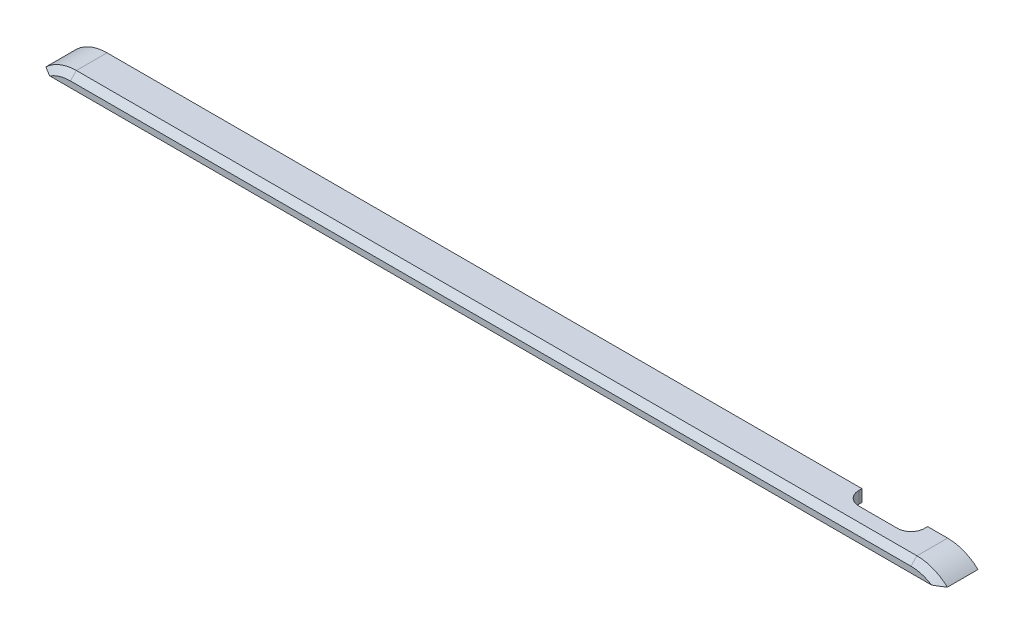
ISO-10303-21;
HEADER;
FILE_DESCRIPTION(('STEP AP214'),'2;1');
FILE_NAME('part.step','',(''),(''),'','','');
FILE_SCHEMA(('AUTOMOTIVE_DESIGN { 1 0 10303 214 1 1 1 1 }'));
ENDSEC;
DATA;
#1=APPLICATION_CONTEXT('core data for automotive mechanical design processes');
#2=APPLICATION_PROTOCOL_DEFINITION('international standard','automotive_design',2000,#1);
#3=PRODUCT_CONTEXT('',#1,'mechanical');
#4=PRODUCT('Part','Part','',(#3));
#5=PRODUCT_RELATED_PRODUCT_CATEGORY('part','',(#4));
#6=PRODUCT_DEFINITION_FORMATION('','',#4);
#7=PRODUCT_DEFINITION_CONTEXT('part definition',#1,'design');
#8=PRODUCT_DEFINITION('design','',#6,#7);
#9=PRODUCT_DEFINITION_SHAPE('','',#8);
#10=(LENGTH_UNIT() NAMED_UNIT(*) SI_UNIT(.MILLI.,.METRE.));
#11=(NAMED_UNIT(*) PLANE_ANGLE_UNIT() SI_UNIT($,.RADIAN.));
#12=(NAMED_UNIT(*) SI_UNIT($,.STERADIAN.) SOLID_ANGLE_UNIT());
#13=UNCERTAINTY_MEASURE_WITH_UNIT(LENGTH_MEASURE(1.E-05),#10,'distance_accuracy_value','');
#14=(GEOMETRIC_REPRESENTATION_CONTEXT(3) GLOBAL_UNCERTAINTY_ASSIGNED_CONTEXT((#13)) GLOBAL_UNIT_ASSIGNED_CONTEXT((#10,
#11,#12)) REPRESENTATION_CONTEXT('',''));
#15=CARTESIAN_POINT('',(0.,0.,0.));
#16=DIRECTION('',(0.,0.,1.));
#17=DIRECTION('',(1.,0.,0.));
#18=AXIS2_PLACEMENT_3D('',#15,#16,#17);
#19=CARTESIAN_POINT('',(-13.48999964809,95.544999648097,2.9));
#20=DIRECTION('',(0.,0.,1.));
#21=DIRECTION('',(1.,0.,0.));
#22=AXIS2_PLACEMENT_3D('',#19,#20,#21);
#23=CYLINDRICAL_SURFACE('',#22,7.40000035190612);
#24=DIRECTION('',(0.,0.,1.));
#25=VECTOR('',#24,1.);
#26=CARTESIAN_POINT('',(-18.549644043465,100.945000000001,2.9));
#27=LINE('',#26,#25);
#28=CARTESIAN_POINT('',(-18.549644043465,100.945000000001,3.09999999999999));
#29=VERTEX_POINT('',#28);
#30=CARTESIAN_POINT('',(-18.549644043465,100.945000000001,-2.));
#31=VERTEX_POINT('',#30);
#32=EDGE_CURVE('E66',#29,#31,#27,.F.);
#33=ORIENTED_EDGE('',*,*,#32,.F.);
#34=CARTESIAN_POINT('',(-13.48999964809,95.544999648097,3.09999999999999));
#35=DIRECTION('',(0.,0.,1.));
#36=DIRECTION('',(1.,0.,0.));
#37=AXIS2_PLACEMENT_3D('',#34,#35,#36);
#38=CIRCLE('',#37,7.40000035190612);
#39=CARTESIAN_POINT('',(-13.490000824045,102.945000000001,3.09999999999999));
#40=VERTEX_POINT('',#39);
#41=EDGE_CURVE('E219',#29,#40,#38,.F.);
#42=ORIENTED_EDGE('',*,*,#41,.T.);
#43=DIRECTION('',(0.,0.,1.));
#44=VECTOR('',#43,1.);
#45=CARTESIAN_POINT('',(-13.490000824045,102.945000000001,2.9));
#46=LINE('',#45,#44);
#47=CARTESIAN_POINT('',(-13.490000824045,102.945000000001,-2.));
#48=VERTEX_POINT('',#47);
#49=EDGE_CURVE('E201',#48,#40,#46,.T.);
#50=ORIENTED_EDGE('',*,*,#49,.F.);
#51=CARTESIAN_POINT('',(-13.48999964809,95.544999648097,-2.));
#52=DIRECTION('',(0.,0.,-1.));
#53=DIRECTION('',(-1.,0.,0.));
#54=AXIS2_PLACEMENT_3D('',#51,#52,#53);
#55=CIRCLE('',#54,7.40000035190612);
#56=EDGE_CURVE('E198',#48,#31,#55,.F.);
#57=ORIENTED_EDGE('',*,*,#56,.T.);
#58=EDGE_LOOP('',(#33,#42,#50,#57));
#59=FACE_BOUND('',#58,.T.);
#60=ADVANCED_FACE('F43',(#59),#23,.T.);
#61=CARTESIAN_POINT('',(126.37999964809,101.945000000001,4.1));
#62=DIRECTION('',(0.,-0.707106781186546,-0.707106781186549));
#63=DIRECTION('',(-1.,0.,0.));
#64=AXIS2_PLACEMENT_3D('',#61,#62,#63);
#65=PLANE('',#64);
#66=DIRECTION('',(0.,0.70710678118669,-0.707106781186405));
#67=VECTOR('',#66,1.);
#68=CARTESIAN_POINT('',(126.380005863851,101.944999999999,4.1));
#69=LINE('',#68,#67);
#70=CARTESIAN_POINT('',(126.380005863851,101.944999999999,4.1));
#71=VERTEX_POINT('',#70);
#72=CARTESIAN_POINT('',(126.380005863851,102.944999999999,3.09999999999999));
#73=VERTEX_POINT('',#72);
#74=EDGE_CURVE('E227',#71,#73,#69,.T.);
#75=ORIENTED_EDGE('',*,*,#74,.T.);
#76=DIRECTION('',(1.,0.,0.));
#77=VECTOR('',#76,1.);
#78=CARTESIAN_POINT('',(111.58999933321,102.945000000001,3.09999999999999));
#79=LINE('',#78,#77);
#80=EDGE_CURVE('E216',#40,#73,#79,.T.);
#81=ORIENTED_EDGE('',*,*,#80,.F.);
#82=DIRECTION('',(0.,-0.707106781186557,0.707106781186538));
#83=VECTOR('',#82,1.);
#84=CARTESIAN_POINT('',(-13.490000824045,102.945000000003,3.09999999999999));
#85=LINE('',#84,#83);
#86=CARTESIAN_POINT('',(-13.490000824045,101.945000000003,4.1));
#87=VERTEX_POINT('',#86);
#88=EDGE_CURVE('E225',#40,#87,#85,.T.);
#89=ORIENTED_EDGE('',*,*,#88,.T.);
#90=DIRECTION('',(-1.,0.,0.));
#91=VECTOR('',#90,1.);
#92=CARTESIAN_POINT('',(126.37999964809,101.945000000001,4.1));
#93=LINE('',#92,#91);
#94=EDGE_CURVE('E213',#71,#87,#93,.T.);
#95=ORIENTED_EDGE('',*,*,#94,.F.);
#96=EDGE_LOOP('',(#75,#81,#89,#95));
#97=FACE_BOUND('',#96,.T.);
#98=ADVANCED_FACE('F247',(#97),#65,.F.);
#99=CARTESIAN_POINT('',(126.37999964809,95.544999648097,4.1));
#100=DIRECTION('',(0.,0.,1.));
#101=DIRECTION('',(1.,0.,0.));
#102=AXIS2_PLACEMENT_3D('',#99,#100,#101);
#103=PLANE('',#102);
#104=DIRECTION('',(-1.,0.,0.));
#105=VECTOR('',#104,1.);
#106=CARTESIAN_POINT('',(126.37999964809,100.945000000001,4.1));
#107=LINE('',#106,#105);
#108=CARTESIAN_POINT('',(129.815112557999,100.945000000001,4.1));
#109=VERTEX_POINT('',#108);
#110=CARTESIAN_POINT('',(-16.925112558001,100.945000000001,4.1));
#111=VERTEX_POINT('',#110);
#112=EDGE_CURVE('E234',#109,#111,#107,.T.);
#113=ORIENTED_EDGE('',*,*,#112,.F.);
#114=CARTESIAN_POINT('',(126.37999964809,95.544999648097,4.1));
#115=DIRECTION('',(0.,0.,1.));
#116=DIRECTION('',(1.,0.,0.));
#117=AXIS2_PLACEMENT_3D('',#114,#115,#116);
#118=CIRCLE('',#117,6.40000035190484);
#119=EDGE_CURVE('E208',#109,#71,#118,.T.);
#120=ORIENTED_EDGE('',*,*,#119,.T.);
#121=ORIENTED_EDGE('',*,*,#94,.T.);
#122=CARTESIAN_POINT('',(-13.48999964809,95.544999648097,4.1));
#123=DIRECTION('',(0.,0.,1.));
#124=DIRECTION('',(1.,0.,0.));
#125=AXIS2_PLACEMENT_3D('',#122,#123,#124);
#126=CIRCLE('',#125,6.40000035190612);
#127=EDGE_CURVE('E210',#87,#111,#126,.T.);
#128=ORIENTED_EDGE('',*,*,#127,.T.);
#129=EDGE_LOOP('',(#113,#120,#121,#128));
#130=FACE_BOUND('',#129,.T.);
#131=ADVANCED_FACE('F246',(#130),#103,.T.);
#132=CARTESIAN_POINT('',(-13.48999964809,95.544999648097,4.1));
#133=DIRECTION('',(0.,0.,-1.));
#134=DIRECTION('',(-1.,0.,0.));
#135=AXIS2_PLACEMENT_3D('',#132,#133,#134);
#136=CONICAL_SURFACE('',#135,6.40000035190612,0.785398163397452);
#137=CARTESIAN_POINT('',(-9.00944418539805,100.945000000001,3.48320756211818));
#138=CARTESIAN_POINT('',(-9.11736197304797,100.945000000001,3.5521074484552));
#139=CARTESIAN_POINT('',(-9.22594553083226,100.945000000001,3.61997900357435));
#140=CARTESIAN_POINT('',(-9.44460972842669,100.945000000001,3.75332454421374));
#141=CARTESIAN_POINT('',(-9.55469072734905,100.945000000001,3.81879794020001));
#142=CARTESIAN_POINT('',(-9.77696502495285,100.945000000001,3.94726253204156));
#143=CARTESIAN_POINT('',(-9.88916563272331,100.945000000001,4.01024114179886));
#144=CARTESIAN_POINT('',(-10.1153208660946,100.945000000001,4.1329405936068));
#145=CARTESIAN_POINT('',(-10.2292753815703,100.945000000001,4.19266163913337));
#146=CARTESIAN_POINT('',(-10.5797748471458,100.945000000001,4.36910594692507));
#147=CARTESIAN_POINT('',(-10.8194017725302,100.945000000001,4.47983725074103));
#148=CARTESIAN_POINT('',(-11.3072076013879,100.945000000001,4.6797492608799));
#149=CARTESIAN_POINT('',(-11.5553700308363,100.945000000001,4.76896908199745));
#150=CARTESIAN_POINT('',(-11.9664119266231,100.945000000001,4.8912227583544));
#151=CARTESIAN_POINT('',(-12.1267409130999,100.945000000001,4.93281793742468));
#152=CARTESIAN_POINT('',(-12.4502592753289,100.945000000001,5.00307774554259));
#153=CARTESIAN_POINT('',(-12.6134486941357,100.945000000001,5.03174217978554));
#154=CARTESIAN_POINT('',(-12.9400897726518,100.945000000001,5.07446199929388));
#155=CARTESIAN_POINT('',(-13.1035223861598,100.945000000001,5.08866102537679));
#156=CARTESIAN_POINT('',(-13.431004213152,100.945000000001,5.10215556839109));
#157=CARTESIAN_POINT('',(-13.5950533932365,100.945000000001,5.1014518812967));
#158=CARTESIAN_POINT('',(-13.9227583715392,100.945000000001,5.08516557353507));
#159=CARTESIAN_POINT('',(-14.0864125284281,100.945000000001,5.06955046475873));
#160=CARTESIAN_POINT('',(-14.411750293435,100.945000000001,5.02426686958916));
#161=CARTESIAN_POINT('',(-14.5734336997909,100.945000000001,4.99459695648095));
#162=CARTESIAN_POINT('',(-14.8948051182586,100.945000000001,4.92247316998566));
#163=CARTESIAN_POINT('',(-15.0544775880741,100.945000000001,4.87995095368624));
#164=CARTESIAN_POINT('',(-15.370442702256,100.945000000001,4.78393507827452));
#165=CARTESIAN_POINT('',(-15.5267354008834,100.945000000001,4.73044159544636));
#166=CARTESIAN_POINT('',(-15.874463538354,100.945000000001,4.59969492946357));
#167=CARTESIAN_POINT('',(-16.0649170216191,100.945000000001,4.5198451185541));
#168=CARTESIAN_POINT('',(-16.4406579292946,100.945000000001,4.3487087837962));
#169=CARTESIAN_POINT('',(-16.6259426680003,100.945000000001,4.25741644486292));
#170=CARTESIAN_POINT('',(-16.9921329634059,100.945000000001,4.06567325682538));
#171=CARTESIAN_POINT('',(-17.1730293197188,100.945000000001,3.96520497095776));
#172=CARTESIAN_POINT('',(-17.5306339133796,100.945000000001,3.75718300285243));
#173=CARTESIAN_POINT('',(-17.7073428250256,100.945000000001,3.64963047206863));
#174=CARTESIAN_POINT('',(-18.0587273965895,100.945000000001,3.42790435203163));
#175=CARTESIAN_POINT('',(-18.233371283848,100.945000000001,3.31368064681412));
#176=CARTESIAN_POINT('',(-18.5795509271449,100.945000000001,3.08062294077936));
#177=CARTESIAN_POINT('',(-18.7510865892495,100.945000000001,2.96178880096983));
#178=CARTESIAN_POINT('',(-19.0913122403084,100.945000000001,2.72051825243802));
#179=CARTESIAN_POINT('',(-19.2600051723948,100.945000000001,2.59808598203824));
#180=CARTESIAN_POINT('',(-19.5951299794649,100.945000000001,2.35015884295758));
#181=CARTESIAN_POINT('',(-19.7615617667756,100.945000000001,2.22466385604829));
#182=CARTESIAN_POINT('',(-20.1083249047972,100.945000000001,1.95900232844192));
#183=CARTESIAN_POINT('',(-20.2884612123179,100.945000000001,1.81858156847848));
#184=CARTESIAN_POINT('',(-20.6467511663923,100.945000000001,1.53523010251118));
#185=CARTESIAN_POINT('',(-20.824904767247,100.945000000001,1.39229933884968));
#186=CARTESIAN_POINT('',(-21.3569512243515,100.945000000001,0.960300736912029));
#187=CARTESIAN_POINT('',(-21.7083135651146,100.945000000001,0.668116482775576));
#188=CARTESIAN_POINT('',(-22.3971899366675,100.945000000001,0.085331926828471));
#189=CARTESIAN_POINT('',(-22.7348293010031,100.945000000001,-0.205121005262719));
#190=CARTESIAN_POINT('',(-23.2384493614037,100.945000000001,-0.643855433070635));
#191=CARTESIAN_POINT('',(-23.4058016254663,100.945000000001,-0.790566600273585));
#192=CARTESIAN_POINT('',(-23.7396938154997,100.945000000001,-1.08490536789007));
#193=CARTESIAN_POINT('',(-23.9062337542065,100.945000000001,-1.23253295385259));
#194=CARTESIAN_POINT('',(-24.0724204772396,100.945000000001,-1.38055663864696));
#195=B_SPLINE_CURVE_WITH_KNOTS('',3,(#137,#138,#139,#140,#141,#142,#143,#144,#145,#146,#147,
#148,#149,#150,#151,#152,#153,#154,#155,#156,#157,#158,#159,#160,#161,#162,#163,#164,#165,#166,
#167,#168,#169,#170,#171,#172,#173,#174,#175,#176,#177,#178,#179,#180,#181,#182,#183,#184,#185,
#186,#187,#188,#189,#190,#191,#192,#193,#194),.UNSPECIFIED.,.F.,.F.,(4,2,2,2,2,2,2,2,2,2,2,2,2,
2,2,2,2,2,2,2,2,2,2,2,2,2,2,2,4),(0.,0.384115829699168,0.768325460492912,1.15427533083495,
1.54020106607223,2.33135916525918,3.12106764807376,3.6175298077362,4.11399944646662,
4.60548964598309,5.09695359440433,5.58949076379726,6.08207794176892,6.5773319953368,
7.07257809188317,7.69162819157976,8.31099417747414,8.93156263676902,9.5520304782717,
10.1779820150825,10.803952437346,11.4292291029944,12.0545299441631,12.7397057539393,
13.4248973236234,14.7957210077469,16.1318193205682,16.7994829199869,17.4671360176154),.UNSPECIFIED.);
#196=EDGE_CURVE('E11',#111,#29,#195,.T.);
#197=ORIENTED_EDGE('',*,*,#196,.F.);
#198=ORIENTED_EDGE('',*,*,#127,.F.);
#199=ORIENTED_EDGE('',*,*,#88,.F.);
#200=ORIENTED_EDGE('',*,*,#41,.F.);
#201=EDGE_LOOP('',(#197,#198,#199,#200));
#202=FACE_BOUND('',#201,.T.);
#203=ADVANCED_FACE('F237',(#202),#136,.T.);
#204=CARTESIAN_POINT('',(126.37999964809,95.544999648097,2.9));
#205=DIRECTION('',(0.,0.,1.));
#206=DIRECTION('',(1.,0.,0.));
#207=AXIS2_PLACEMENT_3D('',#204,#205,#206);
#208=CYLINDRICAL_SURFACE('',#207,7.40000035190483);
#209=DIRECTION('',(0.,0.,1.));
#210=VECTOR('',#209,1.);
#211=CARTESIAN_POINT('',(131.439644043463,100.945000000001,2.9));
#212=LINE('',#211,#210);
#213=CARTESIAN_POINT('',(131.439644043463,100.945000000001,-2.));
#214=VERTEX_POINT('',#213);
#215=CARTESIAN_POINT('',(131.439644043463,100.945000000001,3.09999999999999));
#216=VERTEX_POINT('',#215);
#217=EDGE_CURVE('E275',#214,#216,#212,.T.);
#218=ORIENTED_EDGE('',*,*,#217,.F.);
#219=CARTESIAN_POINT('',(126.37999964809,95.544999648097,-2.));
#220=DIRECTION('',(0.,0.,-1.));
#221=DIRECTION('',(-1.,0.,0.));
#222=AXIS2_PLACEMENT_3D('',#219,#220,#221);
#223=CIRCLE('',#222,7.40000035190483);
#224=CARTESIAN_POINT('',(126.380005863851,102.944999999999,-2.));
#225=VERTEX_POINT('',#224);
#226=EDGE_CURVE('E193',#214,#225,#223,.F.);
#227=ORIENTED_EDGE('',*,*,#226,.T.);
#228=DIRECTION('',(0.,0.,1.));
#229=VECTOR('',#228,1.);
#230=CARTESIAN_POINT('',(126.380005863851,102.944999999999,2.9));
#231=LINE('',#230,#229);
#232=EDGE_CURVE('E200',#225,#73,#231,.T.);
#233=ORIENTED_EDGE('',*,*,#232,.T.);
#234=CARTESIAN_POINT('',(126.37999964809,95.544999648097,3.09999999999999));
#235=DIRECTION('',(0.,0.,1.));
#236=DIRECTION('',(1.,0.,0.));
#237=AXIS2_PLACEMENT_3D('',#234,#235,#236);
#238=CIRCLE('',#237,7.40000035190483);
#239=EDGE_CURVE('E221',#73,#216,#238,.F.);
#240=ORIENTED_EDGE('',*,*,#239,.T.);
#241=EDGE_LOOP('',(#218,#227,#233,#240));
#242=FACE_BOUND('',#241,.T.);
#243=ADVANCED_FACE('F245',(#242),#208,.T.);
#244=CARTESIAN_POINT('',(126.37999964809,95.544999648097,4.1));
#245=DIRECTION('',(0.,0.,-1.));
#246=DIRECTION('',(-1.,0.,0.));
#247=AXIS2_PLACEMENT_3D('',#244,#245,#246);
#248=CONICAL_SURFACE('',#247,6.40000035190484,0.785398163397444);
#249=CARTESIAN_POINT('',(136.962417112996,100.945000000001,-1.38055364200053));
#250=CARTESIAN_POINT('',(136.808383611883,100.945000000001,-1.24335375413489));
#251=CARTESIAN_POINT('',(136.654046041191,100.945000000001,-1.1064952540684));
#252=CARTESIAN_POINT('',(136.344679919963,100.945000000001,-0.833557926565169));
#253=CARTESIAN_POINT('',(136.189651361263,100.945000000001,-0.697479108385042));
#254=CARTESIAN_POINT('',(135.723302024684,100.945000000001,-0.290467785689929));
#255=CARTESIAN_POINT('',(135.410824910571,100.945000000001,-0.0208562467667893));
#256=CARTESIAN_POINT('',(134.777924131539,100.945000000001,0.517166368537898));
#257=CARTESIAN_POINT('',(134.457449945587,100.945000000001,0.785518180391891));
#258=CARTESIAN_POINT('',(133.811297689659,100.945000000001,1.315771186575));
#259=CARTESIAN_POINT('',(133.485620659395,100.945000000001,1.57767364377345));
#260=CARTESIAN_POINT('',(132.845395049356,100.945000000001,2.07838317396464));
#261=CARTESIAN_POINT('',(132.531222797911,100.945000000001,2.31766748996672));
#262=CARTESIAN_POINT('',(132.053599486489,100.945000000001,2.66813407321411));
#263=CARTESIAN_POINT('',(131.893278991497,100.945000000001,2.78358158799918));
#264=CARTESIAN_POINT('',(131.570201115936,100.945000000001,3.011008345907));
#265=CARTESIAN_POINT('',(131.407443860751,100.945000000001,3.12298776657688));
#266=CARTESIAN_POINT('',(131.079608828133,100.945000000001,3.34237903238338));
#267=CARTESIAN_POINT('',(130.914539929207,100.945000000001,3.44980410100192));
#268=CARTESIAN_POINT('',(130.581119625011,100.945000000001,3.65948836513082));
#269=CARTESIAN_POINT('',(130.412767954463,100.945000000001,3.76174714074024));
#270=CARTESIAN_POINT('',(130.072468985105,100.945000000001,3.95972533751126));
#271=CARTESIAN_POINT('',(129.90052548272,100.945000000001,4.05545124800839));
#272=CARTESIAN_POINT('',(129.552403204522,100.945000000001,4.2388295221214));
#273=CARTESIAN_POINT('',(129.376225442852,100.945000000001,4.32648379513939));
#274=CARTESIAN_POINT('',(129.031187573954,100.945000000001,4.48609792615596));
#275=CARTESIAN_POINT('',(128.862635045246,100.945000000001,4.55871750273999));
#276=CARTESIAN_POINT('',(128.521206010536,100.945000000001,4.69309492299969));
#277=CARTESIAN_POINT('',(128.348329502966,100.945000000001,4.7548527627353));
#278=CARTESIAN_POINT('',(127.999110800851,100.945000000001,4.86491299432105));
#279=CARTESIAN_POINT('',(127.822786855402,100.945000000001,4.91327249408334));
#280=CARTESIAN_POINT('',(127.466617652928,100.945000000001,4.99448290523282));
#281=CARTESIAN_POINT('',(127.286773818136,100.945000000001,5.02733995104402));
#282=CARTESIAN_POINT('',(126.922017507536,100.945000000001,5.07591777077046));
#283=CARTESIAN_POINT('',(126.737069422006,100.945000000001,5.09137682625711));
#284=CARTESIAN_POINT('',(126.366567442895,100.945000000001,5.10315757668936));
#285=CARTESIAN_POINT('',(126.181013597776,100.945000000001,5.09948076680736));
#286=CARTESIAN_POINT('',(125.810735666043,100.945000000001,5.07322928214843));
#287=CARTESIAN_POINT('',(125.626015513507,100.945000000001,5.05060015918495));
#288=CARTESIAN_POINT('',(125.259569403364,100.945000000001,4.98794788359992));
#289=CARTESIAN_POINT('',(125.077844201337,100.945000000001,4.9479204093058));
#290=CARTESIAN_POINT('',(124.660941070092,100.945000000001,4.83759555067714));
#291=CARTESIAN_POINT('',(124.427252972316,100.945000000001,4.76171164421561));
#292=CARTESIAN_POINT('',(123.967575826596,100.945000000001,4.58948103038742));
#293=CARTESIAN_POINT('',(123.741591899937,100.945000000001,4.49312100802978));
#294=CARTESIAN_POINT('',(123.296548561388,100.945000000001,4.28478152810212));
#295=CARTESIAN_POINT('',(123.077502417414,100.945000000001,4.17277412648143));
#296=CARTESIAN_POINT('',(122.645899829837,100.945000000001,3.93716400126725));
#297=CARTESIAN_POINT('',(122.433341089832,100.945000000001,3.81356544530082));
#298=CARTESIAN_POINT('',(122.169085494057,100.945000000001,3.65237616059057));
#299=CARTESIAN_POINT('',(122.114847152419,100.945000000001,3.61888471031704));
#300=CARTESIAN_POINT('',(122.006835924423,100.945000000001,3.55141887839316));
#301=CARTESIAN_POINT('',(121.953062280996,100.945000000001,3.51744570907858));
#302=CARTESIAN_POINT('',(121.89945222185,100.945000000001,3.48321269377062));
#303=B_SPLINE_CURVE_WITH_KNOTS('',3,(#249,#250,#251,#252,#253,#254,#255,#256,#257,#258,#259,
#260,#261,#262,#263,#264,#265,#266,#267,#268,#269,#270,#271,#272,#273,#274,#275,#276,#277,#278,
#279,#280,#281,#282,#283,#284,#285,#286,#287,#288,#289,#290,#291,#292,#293,#294,#295,#296,#297,
#298,#299,#300,#301,#302),.UNSPECIFIED.,.F.,.F.,(4,2,2,2,2,2,2,2,2,2,2,2,2,2,2,2,2,2,2,2,2,2,2,
2,2,2,4),(0.,0.618829602834403,1.2376665374397,2.47577203658262,3.7296832864653,
4.98334701935873,6.16789606302936,6.76054695564843,7.35316745751709,7.9439293748151,
8.53473923049445,9.12495340359222,9.7150275968064,10.2653144492259,10.8156015012591,
11.3635056521621,11.9111928115396,12.4670130972046,13.0227899547485,13.5801690051664,
14.1376865852362,14.873485911119,15.6097651770132,16.3473765567009,17.084723735909,
17.2759588858978,17.4667770275373),.UNSPECIFIED.);
#304=EDGE_CURVE('E52',#216,#109,#303,.T.);
#305=ORIENTED_EDGE('',*,*,#304,.F.);
#306=ORIENTED_EDGE('',*,*,#239,.F.);
#307=ORIENTED_EDGE('',*,*,#74,.F.);
#308=ORIENTED_EDGE('',*,*,#119,.F.);
#309=EDGE_LOOP('',(#305,#306,#307,#308));
#310=FACE_BOUND('',#309,.T.);
#311=ADVANCED_FACE('F249',(#310),#248,.T.);
#312=CARTESIAN_POINT('',(0.,82.3491660064344,0.764999999999987));
#313=DIRECTION('',(0.,0.,1.));
#314=DIRECTION('',(1.,0.,0.));
#315=AXIS2_PLACEMENT_3D('',#312,#313,#314);
#316=PLANE('',#315);
#317=DIRECTION('',(0.,1.,0.));
#318=VECTOR('',#317,1.);
#319=CARTESIAN_POINT('',(114.370000000025,82.3491660064344,0.764999999999977));
#320=LINE('',#319,#318);
#321=CARTESIAN_POINT('',(114.370000000025,100.945000000002,0.764999999999977));
#322=VERTEX_POINT('',#321);
#323=CARTESIAN_POINT('',(114.370000000025,102.94499999996,0.764999999999977));
#324=VERTEX_POINT('',#323);
#325=EDGE_CURVE('E157',#322,#324,#320,.T.);
#326=ORIENTED_EDGE('',*,*,#325,.T.);
#327=DIRECTION('',(1.,1.50756392520579E-12,0.));
#328=VECTOR('',#327,1.);
#329=CARTESIAN_POINT('',(1.82353062601583E-11,102.944999999783,0.764999999999987));
#330=LINE('',#329,#328);
#331=CARTESIAN_POINT('',(120.810000000025,102.944999999962,0.764999999999977));
#332=VERTEX_POINT('',#331);
#333=EDGE_CURVE('E160',#324,#332,#330,.T.);
#334=ORIENTED_EDGE('',*,*,#333,.T.);
#335=DIRECTION('',(0.,1.,0.));
#336=VECTOR('',#335,1.);
#337=CARTESIAN_POINT('',(120.810000000025,82.3491660064344,0.764999999999977));
#338=LINE('',#337,#336);
#339=CARTESIAN_POINT('',(120.810000000025,100.945000000002,0.764999999999977));
#340=VERTEX_POINT('',#339);
#341=EDGE_CURVE('E146',#340,#332,#338,.T.);
#342=ORIENTED_EDGE('',*,*,#341,.F.);
#343=DIRECTION('',(1.,3.05311352129676E-13,0.));
#344=VECTOR('',#343,1.);
#345=CARTESIAN_POINT('',(122.589999999998,100.945000000003,0.764999999999988));
#346=LINE('',#345,#344);
#347=EDGE_CURVE('E206',#322,#340,#346,.T.);
#348=ORIENTED_EDGE('',*,*,#347,.F.);
#349=EDGE_LOOP('',(#326,#334,#342,#348));
#350=FACE_BOUND('',#349,.T.);
#351=ADVANCED_FACE('F161',(#350),#316,.F.);
#352=CARTESIAN_POINT('',(111.58999933321,102.945000000001,2.9));
#353=DIRECTION('',(0.,1.,0.));
#354=DIRECTION('',(-1.,0.,0.));
#355=AXIS2_PLACEMENT_3D('',#352,#353,#354);
#356=PLANE('',#355);
#357=ORIENTED_EDGE('',*,*,#49,.T.);
#358=ORIENTED_EDGE('',*,*,#80,.T.);
#359=ORIENTED_EDGE('',*,*,#232,.F.);
#360=DIRECTION('',(-1.,0.,0.));
#361=VECTOR('',#360,1.);
#362=CARTESIAN_POINT('',(0.,102.945000000001,-2.));
#363=LINE('',#362,#361);
#364=CARTESIAN_POINT('',(123.060000000025,102.944999999968,-2.));
#365=VERTEX_POINT('',#364);
#366=EDGE_CURVE('E196',#225,#365,#363,.T.);
#367=ORIENTED_EDGE('',*,*,#366,.T.);
#368=DIRECTION('',(0.,0.,-1.));
#369=VECTOR('',#368,1.);
#370=CARTESIAN_POINT('',(123.060000000025,102.944999999968,0.));
#371=LINE('',#370,#369);
#372=CARTESIAN_POINT('',(123.060000000025,102.944999999968,-1.48500000000002));
#373=VERTEX_POINT('',#372);
#374=EDGE_CURVE('E172',#373,#365,#371,.T.);
#375=ORIENTED_EDGE('',*,*,#374,.F.);
#376=CARTESIAN_POINT('',(120.810000000025,102.944999999965,-1.48500000000002));
#377=DIRECTION('',(-1.50756392520579E-12,1.,0.));
#378=DIRECTION('',(-1.,-1.50756392520579E-12,0.));
#379=AXIS2_PLACEMENT_3D('',#376,#377,#378);
#380=CIRCLE('',#379,2.25);
#381=EDGE_CURVE('E151',#332,#373,#380,.T.);
#382=ORIENTED_EDGE('',*,*,#381,.F.);
#383=ORIENTED_EDGE('',*,*,#333,.F.);
#384=CARTESIAN_POINT('',(114.370000000025,102.944999999955,-1.48500000000002));
#385=DIRECTION('',(-1.50756392520579E-12,1.,0.));
#386=DIRECTION('',(-1.,-1.50756392520579E-12,0.));
#387=AXIS2_PLACEMENT_3D('',#384,#385,#386);
#388=CIRCLE('',#387,2.25);
#389=CARTESIAN_POINT('',(112.120000000025,102.944999999952,-1.48500000000002));
#390=VERTEX_POINT('',#389);
#391=EDGE_CURVE('E167',#390,#324,#388,.T.);
#392=ORIENTED_EDGE('',*,*,#391,.F.);
#393=DIRECTION('',(0.,0.,1.));
#394=VECTOR('',#393,1.);
#395=CARTESIAN_POINT('',(112.120000000025,102.944999999952,0.));
#396=LINE('',#395,#394);
#397=CARTESIAN_POINT('',(112.120000000025,102.944999999952,-2.));
#398=VERTEX_POINT('',#397);
#399=EDGE_CURVE('E175',#398,#390,#396,.T.);
#400=ORIENTED_EDGE('',*,*,#399,.F.);
#401=EDGE_CURVE('E195',#398,#48,#363,.T.);
#402=ORIENTED_EDGE('',*,*,#401,.T.);
#403=EDGE_LOOP('',(#357,#358,#359,#367,#375,#382,#383,#392,#400,#402));
#404=FACE_BOUND('',#403,.T.);
#405=ADVANCED_FACE('F170',(#404),#356,.T.);
#406=CARTESIAN_POINT('',(120.810000000025,82.3491660064344,-1.48500000000002));
#407=DIRECTION('',(0.,1.,0.));
#408=DIRECTION('',(0.,0.,1.));
#409=AXIS2_PLACEMENT_3D('',#406,#407,#408);
#410=CYLINDRICAL_SURFACE('',#409,2.25);
#411=DIRECTION('',(0.,1.,0.));
#412=VECTOR('',#411,1.);
#413=CARTESIAN_POINT('',(123.060000000025,82.3491660064344,-1.48500000000002));
#414=LINE('',#413,#412);
#415=CARTESIAN_POINT('',(123.060000000025,100.945000000001,-1.48500000000002));
#416=VERTEX_POINT('',#415);
#417=EDGE_CURVE('E156',#416,#373,#414,.T.);
#418=ORIENTED_EDGE('',*,*,#417,.F.);
#419=CARTESIAN_POINT('',(120.810000000025,100.945000000003,-1.48500000000002));
#420=DIRECTION('',(-3.05311352129676E-13,1.,0.));
#421=DIRECTION('',(-1.,-3.05311352129676E-13,0.));
#422=AXIS2_PLACEMENT_3D('',#419,#420,#421);
#423=CIRCLE('',#422,2.25);
#424=EDGE_CURVE('E153',#340,#416,#423,.T.);
#425=ORIENTED_EDGE('',*,*,#424,.F.);
#426=ORIENTED_EDGE('',*,*,#341,.T.);
#427=ORIENTED_EDGE('',*,*,#381,.T.);
#428=EDGE_LOOP('',(#418,#425,#426,#427));
#429=FACE_BOUND('',#428,.T.);
#430=ADVANCED_FACE('F149',(#429),#410,.F.);
#431=CARTESIAN_POINT('',(0.,0.,-2.));
#432=DIRECTION('',(0.,0.,-1.));
#433=DIRECTION('',(-1.,0.,0.));
#434=AXIS2_PLACEMENT_3D('',#431,#432,#433);
#435=PLANE('',#434);
#436=DIRECTION('',(1.,0.,0.));
#437=VECTOR('',#436,1.);
#438=CARTESIAN_POINT('',(0.,100.945000000001,-2.));
#439=LINE('',#438,#437);
#440=CARTESIAN_POINT('',(123.060000000025,100.945000000001,-2.));
#441=VERTEX_POINT('',#440);
#442=EDGE_CURVE('E263',#441,#214,#439,.T.);
#443=ORIENTED_EDGE('',*,*,#442,.F.);
#444=DIRECTION('',(0.,-1.,0.));
#445=VECTOR('',#444,1.);
#446=CARTESIAN_POINT('',(123.060000000025,0.,-2.));
#447=LINE('',#446,#445);
#448=EDGE_CURVE('E190',#365,#441,#447,.T.);
#449=ORIENTED_EDGE('',*,*,#448,.F.);
#450=ORIENTED_EDGE('',*,*,#366,.F.);
#451=ORIENTED_EDGE('',*,*,#226,.F.);
#452=EDGE_LOOP('',(#443,#449,#450,#451));
#453=FACE_BOUND('',#452,.T.);
#454=ADVANCED_FACE('F288',(#453),#435,.T.);
#455=CARTESIAN_POINT('',(123.060000000025,82.3491660064344,0.));
#456=DIRECTION('',(1.,0.,0.));
#457=DIRECTION('',(0.,0.,-1.));
#458=AXIS2_PLACEMENT_3D('',#455,#456,#457);
#459=PLANE('',#458);
#460=ORIENTED_EDGE('',*,*,#448,.T.);
#461=DIRECTION('',(0.,0.,1.));
#462=VECTOR('',#461,1.);
#463=CARTESIAN_POINT('',(123.060000000025,100.945000000001,0.));
#464=LINE('',#463,#462);
#465=EDGE_CURVE('E274',#441,#416,#464,.T.);
#466=ORIENTED_EDGE('',*,*,#465,.T.);
#467=ORIENTED_EDGE('',*,*,#417,.T.);
#468=ORIENTED_EDGE('',*,*,#374,.T.);
#469=EDGE_LOOP('',(#460,#466,#467,#468));
#470=FACE_BOUND('',#469,.T.);
#471=ADVANCED_FACE('F283',(#470),#459,.F.);
#472=CARTESIAN_POINT('',(56.4449957534975,99.9449999999518,1.00857997860453));
#473=DIRECTION('',(0.,0.,-1.));
#474=DIRECTION('',(-1.,0.,0.));
#475=AXIS2_PLACEMENT_3D('',#472,#473,#474);
#476=CONICAL_SURFACE('',#475,1.65,1.02974425867665);
#477=CARTESIAN_POINT('',(56.4449957534975,99.9449999999518,1.00857997860453));
#478=DIRECTION('',(0.,0.,-1.));
#479=DIRECTION('',(-1.,0.,0.));
#480=AXIS2_PLACEMENT_3D('',#477,#478,#479);
#481=CIRCLE('',#480,1.65);
#482=CARTESIAN_POINT('',(55.1325552786942,100.945000000001,1.00857997860453));
#483=VERTEX_POINT('',#482);
#484=CARTESIAN_POINT('',(57.7574362283008,100.945000000001,1.00857997860453));
#485=VERTEX_POINT('',#484);
#486=EDGE_CURVE('E173',#483,#485,#481,.T.);
#487=ORIENTED_EDGE('',*,*,#486,.T.);
#488=CARTESIAN_POINT('',(47.8286947317029,100.945000000001,-3.21194700190064));
#489=CARTESIAN_POINT('',(48.1053934310801,100.945000000001,-3.0468046387786));
#490=CARTESIAN_POINT('',(48.3821332864335,100.945000000001,-2.8817311350792));
#491=CARTESIAN_POINT('',(48.9357738894948,100.945000000001,-2.55177695552656));
#492=CARTESIAN_POINT('',(49.2126746527677,100.945000000001,-2.38689630579264));
#493=CARTESIAN_POINT('',(49.7673984819783,100.945000000001,-2.05697702490594));
#494=CARTESIAN_POINT('',(50.0452220137386,100.945000000001,-1.89193917656281));
#495=CARTESIAN_POINT('',(50.6010889729636,100.945000000001,-1.56231046006224));
#496=CARTESIAN_POINT('',(50.879132370002,100.945000000001,-1.3977195405896));
#497=CARTESIAN_POINT('',(51.4846384796084,100.945000000001,-1.0402211209324));
#498=CARTESIAN_POINT('',(51.8121736202054,100.945000000001,-0.847436033733313));
#499=CARTESIAN_POINT('',(52.304255154799,100.945000000001,-0.55943989967491));
#500=CARTESIAN_POINT('',(52.4684446359682,100.945000000001,-0.463619299749576));
#501=CARTESIAN_POINT('',(52.7971591153352,100.945000000001,-0.272568574037961));
#502=CARTESIAN_POINT('',(52.9616841008825,100.945000000001,-0.177338426515787));
#503=CARTESIAN_POINT('',(53.2909241799103,100.945000000001,0.0120758789461164));
#504=CARTESIAN_POINT('',(53.455638335623,100.945000000001,0.106261665801242));
#505=CARTESIAN_POINT('',(53.7858532441179,100.945000000001,0.293306929013183));
#506=CARTESIAN_POINT('',(53.951354106877,100.945000000001,0.386166212204018));
#507=CARTESIAN_POINT('',(54.200499210464,100.945000000001,0.523702127491785));
#508=CARTESIAN_POINT('',(54.2836675876073,100.945000000001,0.569239796046644));
#509=CARTESIAN_POINT('',(54.450428404919,100.945000000001,0.659530870124658));
#510=CARTESIAN_POINT('',(54.5340208380544,100.945000000001,0.704284288600343));
#511=CARTESIAN_POINT('',(54.7017589112984,100.945000000001,0.792695696142878));
#512=CARTESIAN_POINT('',(54.7859044158804,100.945000000001,0.836353941807722));
#513=CARTESIAN_POINT('',(54.9549816006546,100.945000000001,0.922116582174809));
#514=CARTESIAN_POINT('',(55.0399132120795,100.945000000001,0.964221111216213));
#515=CARTESIAN_POINT('',(55.1610499175038,100.945000000001,1.02222791027333));
#516=CARTESIAN_POINT('',(55.19679322957,100.945000000001,1.03909431127861));
#517=CARTESIAN_POINT('',(55.2685089791966,100.945000000001,1.07233679806618));
#518=CARTESIAN_POINT('',(55.3044814240158,100.945000000001,1.08871286822021));
#519=CARTESIAN_POINT('',(55.3767006095182,100.945000000001,1.12087983780277));
#520=CARTESIAN_POINT('',(55.4129474268174,100.945000000001,1.13667056593041));
#521=CARTESIAN_POINT('',(55.4857456901373,100.945000000001,1.16753200672661));
#522=CARTESIAN_POINT('',(55.5222971349854,100.945000000001,1.18260272216546));
#523=CARTESIAN_POINT('',(55.6317673493251,100.945000000001,1.22622840035158));
#524=CARTESIAN_POINT('',(55.7052018010002,100.945000000001,1.25351477685478));
#525=CARTESIAN_POINT('',(55.853796357784,100.945000000001,1.30297548275943));
#526=CARTESIAN_POINT('',(55.9289556251698,100.945000000001,1.32515223838799));
#527=CARTESIAN_POINT('',(56.0575691840264,100.945000000001,1.35626622661916));
#528=CARTESIAN_POINT('',(56.1105379608384,100.945000000001,1.3671767018418));
#529=CARTESIAN_POINT('',(56.217201274048,100.945000000001,1.38451781193427));
#530=CARTESIAN_POINT('',(56.2708954549177,100.945000000001,1.39095056559057));
#531=CARTESIAN_POINT('',(56.3784085311681,100.945000000001,1.39865745900848));
#532=CARTESIAN_POINT('',(56.4322256117306,100.945000000001,1.39995604484037));
#533=CARTESIAN_POINT('',(56.5397343803764,100.945000000001,1.39731387033397));
#534=CARTESIAN_POINT('',(56.5934260415928,100.945000000001,1.39337207507867));
#535=CARTESIAN_POINT('',(56.7186679622946,100.945000000001,1.37848210935917));
#536=CARTESIAN_POINT('',(56.7899832195602,100.945000000001,1.36558466899269));
#537=CARTESIAN_POINT('',(56.9310602746773,100.945000000001,1.33307727017488));
#538=CARTESIAN_POINT('',(57.0008204475873,100.945000000001,1.31346061144494));
#539=CARTESIAN_POINT('',(57.1404171261567,100.945000000001,1.26901574448725));
#540=CARTESIAN_POINT('',(57.2102175344459,100.945000000001,1.244076751669));
#541=CARTESIAN_POINT('',(57.3139133462206,100.945000000001,1.20415559999679));
#542=CARTESIAN_POINT('',(57.3483061243177,100.945000000001,1.19043199366054));
#543=CARTESIAN_POINT('',(57.4168021898829,100.945000000001,1.16228223218064));
#544=CARTESIAN_POINT('',(57.4509054882226,100.945000000001,1.14785610355894));
#545=CARTESIAN_POINT('',(57.5674645093342,100.945000000001,1.09738004948625));
#546=CARTESIAN_POINT('',(57.6493067341237,100.945000000001,1.05991592189981));
#547=CARTESIAN_POINT('',(57.8119453373596,100.945000000001,0.982773727308701));
#548=CARTESIAN_POINT('',(57.8927415077406,100.945000000001,0.943095227942718));
#549=CARTESIAN_POINT('',(58.0536173941963,100.945000000001,0.862209920121564));
#550=CARTESIAN_POINT('',(58.1336966991803,100.945000000001,0.821002296757256));
#551=CARTESIAN_POINT('',(58.2932990246373,100.945000000001,0.737521345827516));
#552=CARTESIAN_POINT('',(58.3728220254387,100.945000000001,0.695247980817164));
#553=CARTESIAN_POINT('',(58.6110959813195,100.945000000001,0.567113754430563));
#554=CARTESIAN_POINT('',(58.7692283869666,100.945000000001,0.480104793540746));
#555=CARTESIAN_POINT('',(59.0844753062053,100.945000000001,0.304395982904285));
#556=CARTESIAN_POINT('',(59.2415901387648,100.945000000001,0.21569670116998));
#557=CARTESIAN_POINT('',(59.5321400831654,100.945000000001,0.0503365202202997));
#558=CARTESIAN_POINT('',(59.6656595020956,100.945000000001,-0.0261763721659666));
#559=CARTESIAN_POINT('',(59.9323917677731,100.945000000001,-0.179764946294769));
#560=CARTESIAN_POINT('',(60.0656045822265,100.945000000001,-0.25684068404629));
#561=CARTESIAN_POINT('',(60.3313120544922,100.945000000001,-0.411112588677932));
#562=CARTESIAN_POINT('',(60.4638075609842,100.945000000001,-0.488307294907052));
#563=CARTESIAN_POINT('',(60.7286058044819,100.945000000001,-0.642993446865916));
#564=CARTESIAN_POINT('',(60.8609085610313,100.945000000001,-0.720484859130811));
#565=CARTESIAN_POINT('',(60.993148967562,100.945000000001,-0.798082015919116));
#566=B_SPLINE_CURVE_WITH_KNOTS('',3,(#488,#489,#490,#491,#492,#493,#494,#495,#496,#497,#498,
#499,#500,#501,#502,#503,#504,#505,#506,#507,#508,#509,#510,#511,#512,#513,#514,#515,#516,#517,
#518,#519,#520,#521,#522,#523,#524,#525,#526,#527,#528,#529,#530,#531,#532,#533,#534,#535,#536,
#537,#538,#539,#540,#541,#542,#543,#544,#545,#546,#547,#548,#549,#550,#551,#552,#553,#554,#555,
#556,#557,#558,#559,#560,#561,#562,#563,#564,#565),.UNSPECIFIED.,.F.,.F.,(4,2,2,2,2,2,2,2,2,2,2,
2,2,2,2,2,2,2,2,2,2,2,2,2,2,2,2,2,2,2,2,2,2,2,2,2,2,2,4),(0.,0.966699356304853,1.93351721934464,
2.90295521045396,3.87227674014944,5.01245253684167,5.58276571619347,6.15305777486583,
6.72227848312789,7.29158125347726,7.57603567185606,7.86048538780179,8.14486782289067,
8.42922561150214,8.54779138512747,8.66636093377233,8.7849649122785,8.90356843441278,
9.13847158505847,9.37326296452002,9.53535161668433,9.69736351884798,9.85860307411652,
10.0198744771358,10.2368312780626,10.454005057138,10.6762392467927,10.7873234007072,
10.8984033641696,11.1683719978591,11.4383935292466,11.7085610890306,11.9787381544398,
12.5201829277355,13.0614488558648,13.5231122252976,13.9848221786748,14.4448507855991,
14.9048289514987),.UNSPECIFIED.);
#567=EDGE_CURVE('E267',#485,#483,#566,.F.);
#568=ORIENTED_EDGE('',*,*,#567,.T.);
#569=EDGE_LOOP('',(#487,#568));
#570=FACE_BOUND('',#569,.T.);
#571=ADVANCED_FACE('F277',(#570),#476,.F.);
#572=DIRECTION('',(1.,0.,0.));
#573=VECTOR('',#572,1.);
#574=CARTESIAN_POINT('',(0.,100.945000000001,-2.));
#575=LINE('',#574,#573);
#576=CARTESIAN_POINT('',(55.1325552786942,100.945000000001,-2.));
#577=VERTEX_POINT('',#576);
#578=EDGE_CURVE('E339',#31,#577,#575,.T.);
#579=ORIENTED_EDGE('',*,*,#578,.F.);
#580=ORIENTED_EDGE('',*,*,#56,.F.);
#581=ORIENTED_EDGE('',*,*,#401,.F.);
#582=DIRECTION('',(0.,1.,0.));
#583=VECTOR('',#582,1.);
#584=CARTESIAN_POINT('',(112.120000000025,0.,-2.));
#585=LINE('',#584,#583);
#586=CARTESIAN_POINT('',(112.120000000025,100.945000000001,-2.));
#587=VERTEX_POINT('',#586);
#588=EDGE_CURVE('E188',#587,#398,#585,.T.);
#589=ORIENTED_EDGE('',*,*,#588,.F.);
#590=CARTESIAN_POINT('',(57.7574362283008,100.945000000001,-2.));
#591=VERTEX_POINT('',#590);
#592=EDGE_CURVE('E264',#591,#587,#575,.T.);
#593=ORIENTED_EDGE('',*,*,#592,.F.);
#594=CARTESIAN_POINT('',(56.4449957534975,99.9449999999518,-2.));
#595=DIRECTION('',(0.,0.,-1.));
#596=DIRECTION('',(-1.,0.,0.));
#597=AXIS2_PLACEMENT_3D('',#594,#595,#596);
#598=CIRCLE('',#597,1.64999999999999);
#599=EDGE_CURVE('E178',#577,#591,#598,.T.);
#600=ORIENTED_EDGE('',*,*,#599,.F.);
#601=EDGE_LOOP('',(#579,#580,#581,#589,#593,#600));
#602=FACE_BOUND('',#601,.T.);
#603=ADVANCED_FACE('F282',(#602),#435,.T.);
#604=CARTESIAN_POINT('',(56.4449957534975,99.9449999999518,-2.));
#605=DIRECTION('',(0.,0.,-1.));
#606=DIRECTION('',(-1.,0.,0.));
#607=AXIS2_PLACEMENT_3D('',#604,#605,#606);
#608=CYLINDRICAL_SURFACE('',#607,1.65);
#609=ORIENTED_EDGE('',*,*,#599,.T.);
#610=DIRECTION('',(0.,0.,-1.));
#611=VECTOR('',#610,1.);
#612=CARTESIAN_POINT('',(57.7574362283008,100.945000000001,-2.));
#613=LINE('',#612,#611);
#614=EDGE_CURVE('E266',#591,#485,#613,.F.);
#615=ORIENTED_EDGE('',*,*,#614,.T.);
#616=ORIENTED_EDGE('',*,*,#486,.F.);
#617=DIRECTION('',(0.,0.,-1.));
#618=VECTOR('',#617,1.);
#619=CARTESIAN_POINT('',(55.1325552786942,100.945000000001,-2.));
#620=LINE('',#619,#618);
#621=EDGE_CURVE('E224',#483,#577,#620,.T.);
#622=ORIENTED_EDGE('',*,*,#621,.T.);
#623=EDGE_LOOP('',(#609,#615,#616,#622));
#624=FACE_BOUND('',#623,.T.);
#625=ADVANCED_FACE('F285',(#624),#608,.F.);
#626=CARTESIAN_POINT('',(114.370000000025,82.3491660064344,-1.48500000000002));
#627=DIRECTION('',(0.,1.,0.));
#628=DIRECTION('',(0.,0.,1.));
#629=AXIS2_PLACEMENT_3D('',#626,#627,#628);
#630=CYLINDRICAL_SURFACE('',#629,2.25);
#631=CARTESIAN_POINT('',(114.370000000025,100.945000000001,-1.48500000000002));
#632=DIRECTION('',(-3.05311352129676E-13,1.,0.));
#633=DIRECTION('',(-1.,-3.05311352129676E-13,0.));
#634=AXIS2_PLACEMENT_3D('',#631,#632,#633);
#635=CIRCLE('',#634,2.25);
#636=CARTESIAN_POINT('',(112.120000000025,100.945000000001,-1.48500000000002));
#637=VERTEX_POINT('',#636);
#638=EDGE_CURVE('E182',#637,#322,#635,.T.);
#639=ORIENTED_EDGE('',*,*,#638,.F.);
#640=DIRECTION('',(0.,1.,0.));
#641=VECTOR('',#640,1.);
#642=CARTESIAN_POINT('',(112.120000000025,82.3491660064344,-1.48500000000002));
#643=LINE('',#642,#641);
#644=EDGE_CURVE('E166',#637,#390,#643,.T.);
#645=ORIENTED_EDGE('',*,*,#644,.T.);
#646=ORIENTED_EDGE('',*,*,#391,.T.);
#647=ORIENTED_EDGE('',*,*,#325,.F.);
#648=EDGE_LOOP('',(#639,#645,#646,#647));
#649=FACE_BOUND('',#648,.T.);
#650=ADVANCED_FACE('F294',(#649),#630,.F.);
#651=CARTESIAN_POINT('',(112.120000000025,82.3491660064344,0.));
#652=DIRECTION('',(-1.,0.,0.));
#653=DIRECTION('',(0.,0.,1.));
#654=AXIS2_PLACEMENT_3D('',#651,#652,#653);
#655=PLANE('',#654);
#656=ORIENTED_EDGE('',*,*,#644,.F.);
#657=DIRECTION('',(0.,0.,-1.));
#658=VECTOR('',#657,1.);
#659=CARTESIAN_POINT('',(112.120000000025,100.945000000001,0.));
#660=LINE('',#659,#658);
#661=EDGE_CURVE('E47',#637,#587,#660,.T.);
#662=ORIENTED_EDGE('',*,*,#661,.T.);
#663=ORIENTED_EDGE('',*,*,#588,.T.);
#664=ORIENTED_EDGE('',*,*,#399,.T.);
#665=EDGE_LOOP('',(#656,#662,#663,#664));
#666=FACE_BOUND('',#665,.T.);
#667=ADVANCED_FACE('F297',(#666),#655,.F.);
#668=CARTESIAN_POINT('',(122.589999999998,100.945000000003,-201.926139944087));
#669=DIRECTION('',(-3.05311352129676E-13,1.,0.));
#670=DIRECTION('',(-1.,-3.05311352129676E-13,0.));
#671=AXIS2_PLACEMENT_3D('',#668,#669,#670);
#672=PLANE('',#671);
#673=ORIENTED_EDGE('',*,*,#661,.F.);
#674=ORIENTED_EDGE('',*,*,#638,.T.);
#675=ORIENTED_EDGE('',*,*,#347,.T.);
#676=ORIENTED_EDGE('',*,*,#424,.T.);
#677=ORIENTED_EDGE('',*,*,#465,.F.);
#678=ORIENTED_EDGE('',*,*,#442,.T.);
#679=ORIENTED_EDGE('',*,*,#217,.T.);
#680=ORIENTED_EDGE('',*,*,#304,.T.);
#681=ORIENTED_EDGE('',*,*,#112,.T.);
#682=ORIENTED_EDGE('',*,*,#196,.T.);
#683=ORIENTED_EDGE('',*,*,#32,.T.);
#684=ORIENTED_EDGE('',*,*,#578,.T.);
#685=ORIENTED_EDGE('',*,*,#621,.F.);
#686=ORIENTED_EDGE('',*,*,#567,.F.);
#687=ORIENTED_EDGE('',*,*,#614,.F.);
#688=ORIENTED_EDGE('',*,*,#592,.T.);
#689=EDGE_LOOP('',(#673,#674,#675,#676,#677,#678,#679,#680,#681,#682,#683,#684,#685,#686,#687,#688));
#690=FACE_BOUND('',#689,.T.);
#691=ADVANCED_FACE('F301',(#690),#672,.F.);
#692=CLOSED_SHELL('',(#60,#98,#131,#203,#243,#311,#351,#405,#430,#454,#471,#571,#603,#625,#650,
#667,#691));
#693=MANIFOLD_SOLID_BREP('B2',#692);
#694=ADVANCED_BREP_SHAPE_REPRESENTATION('',(#18,#693),#14);
#695=SHAPE_DEFINITION_REPRESENTATION(#9,#694);
ENDSEC;
END-ISO-10303-21;
